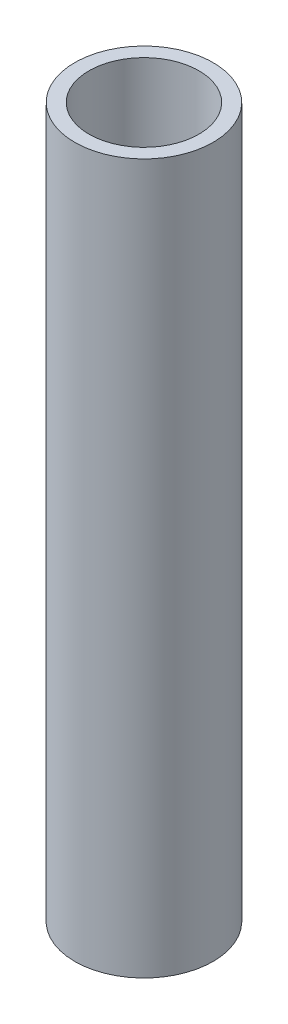
ISO-10303-21;
HEADER;
FILE_DESCRIPTION(('STEP AP214'),'2;1');
FILE_NAME('part.step','',(''),(''),'','','');
FILE_SCHEMA(('AUTOMOTIVE_DESIGN { 1 0 10303 214 1 1 1 1 }'));
ENDSEC;
DATA;
#1=APPLICATION_CONTEXT('core data for automotive mechanical design processes');
#2=APPLICATION_PROTOCOL_DEFINITION('international standard','automotive_design',2000,#1);
#3=PRODUCT_CONTEXT('',#1,'mechanical');
#4=PRODUCT('Part','Part','',(#3));
#5=PRODUCT_RELATED_PRODUCT_CATEGORY('part','',(#4));
#6=PRODUCT_DEFINITION_FORMATION('','',#4);
#7=PRODUCT_DEFINITION_CONTEXT('part definition',#1,'design');
#8=PRODUCT_DEFINITION('design','',#6,#7);
#9=PRODUCT_DEFINITION_SHAPE('','',#8);
#10=(LENGTH_UNIT() NAMED_UNIT(*) SI_UNIT(.MILLI.,.METRE.));
#11=(NAMED_UNIT(*) PLANE_ANGLE_UNIT() SI_UNIT($,.RADIAN.));
#12=(NAMED_UNIT(*) SI_UNIT($,.STERADIAN.) SOLID_ANGLE_UNIT());
#13=UNCERTAINTY_MEASURE_WITH_UNIT(LENGTH_MEASURE(1.E-05),#10,'distance_accuracy_value','');
#14=(GEOMETRIC_REPRESENTATION_CONTEXT(3) GLOBAL_UNCERTAINTY_ASSIGNED_CONTEXT((#13)) GLOBAL_UNIT_ASSIGNED_CONTEXT((#10,
#11,#12)) REPRESENTATION_CONTEXT('',''));
#15=CARTESIAN_POINT('',(0.,0.,0.));
#16=DIRECTION('',(0.,0.,1.));
#17=DIRECTION('',(1.,0.,0.));
#18=AXIS2_PLACEMENT_3D('',#15,#16,#17);
#19=CARTESIAN_POINT('',(0.,20.,0.));
#20=DIRECTION('',(0.,1.,0.));
#21=DIRECTION('',(0.,0.,1.));
#22=AXIS2_PLACEMENT_3D('',#19,#20,#21);
#23=PLANE('',#22);
#24=CARTESIAN_POINT('',(0.,20.,0.));
#25=DIRECTION('',(0.,1.,0.));
#26=DIRECTION('',(0.,0.,1.));
#27=AXIS2_PLACEMENT_3D('',#24,#25,#26);
#28=CIRCLE('',#27,1.95);
#29=CARTESIAN_POINT('',(0.,20.,1.95));
#30=VERTEX_POINT('',#29);
#31=EDGE_CURVE('E10',#30,#30,#28,.T.);
#32=ORIENTED_EDGE('',*,*,#31,.T.);
#33=EDGE_LOOP('',(#32));
#34=FACE_BOUND('',#33,.T.);
#35=CARTESIAN_POINT('',(0.,20.,0.));
#36=DIRECTION('',(0.,1.,0.));
#37=DIRECTION('',(0.,0.,1.));
#38=AXIS2_PLACEMENT_3D('',#35,#36,#37);
#39=CIRCLE('',#38,1.55);
#40=CARTESIAN_POINT('',(0.,20.,1.55));
#41=VERTEX_POINT('',#40);
#42=EDGE_CURVE('E42',#41,#41,#39,.T.);
#43=ORIENTED_EDGE('',*,*,#42,.F.);
#44=EDGE_LOOP('',(#43));
#45=FACE_BOUND('',#44,.T.);
#46=ADVANCED_FACE('F31',(#34,#45),#23,.T.);
#47=CARTESIAN_POINT('',(0.,0.,0.));
#48=DIRECTION('',(0.,1.,0.));
#49=DIRECTION('',(0.,0.,1.));
#50=AXIS2_PLACEMENT_3D('',#47,#48,#49);
#51=PLANE('',#50);
#52=CARTESIAN_POINT('',(0.,0.,0.));
#53=DIRECTION('',(0.,1.,0.));
#54=DIRECTION('',(0.,0.,1.));
#55=AXIS2_PLACEMENT_3D('',#52,#53,#54);
#56=CIRCLE('',#55,1.95);
#57=CARTESIAN_POINT('',(0.,0.,1.95));
#58=VERTEX_POINT('',#57);
#59=EDGE_CURVE('E35',#58,#58,#56,.T.);
#60=ORIENTED_EDGE('',*,*,#59,.F.);
#61=EDGE_LOOP('',(#60));
#62=FACE_BOUND('',#61,.T.);
#63=CARTESIAN_POINT('',(0.,0.,0.));
#64=DIRECTION('',(0.,1.,0.));
#65=DIRECTION('',(0.,0.,1.));
#66=AXIS2_PLACEMENT_3D('',#63,#64,#65);
#67=CIRCLE('',#66,1.55);
#68=CARTESIAN_POINT('',(0.,0.,1.55));
#69=VERTEX_POINT('',#68);
#70=EDGE_CURVE('E44',#69,#69,#67,.T.);
#71=ORIENTED_EDGE('',*,*,#70,.T.);
#72=EDGE_LOOP('',(#71));
#73=FACE_BOUND('',#72,.T.);
#74=ADVANCED_FACE('F54',(#62,#73),#51,.F.);
#75=CARTESIAN_POINT('',(0.,20.,0.));
#76=DIRECTION('',(0.,-1.,0.));
#77=DIRECTION('',(0.,0.,-1.));
#78=AXIS2_PLACEMENT_3D('',#75,#76,#77);
#79=CYLINDRICAL_SURFACE('',#78,1.95);
#80=ORIENTED_EDGE('',*,*,#31,.F.);
#81=EDGE_LOOP('',(#80));
#82=FACE_BOUND('',#81,.T.);
#83=ORIENTED_EDGE('',*,*,#59,.T.);
#84=EDGE_LOOP('',(#83));
#85=FACE_BOUND('',#84,.T.);
#86=ADVANCED_FACE('F33',(#82,#85),#79,.T.);
#87=CARTESIAN_POINT('',(0.,20.,0.));
#88=DIRECTION('',(0.,-1.,0.));
#89=DIRECTION('',(0.,0.,-1.));
#90=AXIS2_PLACEMENT_3D('',#87,#88,#89);
#91=CYLINDRICAL_SURFACE('',#90,1.55);
#92=ORIENTED_EDGE('',*,*,#42,.T.);
#93=EDGE_LOOP('',(#92));
#94=FACE_BOUND('',#93,.T.);
#95=ORIENTED_EDGE('',*,*,#70,.F.);
#96=EDGE_LOOP('',(#95));
#97=FACE_BOUND('',#96,.T.);
#98=ADVANCED_FACE('F50',(#94,#97),#91,.F.);
#99=CLOSED_SHELL('',(#46,#74,#86,#98));
#100=MANIFOLD_SOLID_BREP('B2',#99);
#101=ADVANCED_BREP_SHAPE_REPRESENTATION('',(#18,#100),#14);
#102=SHAPE_DEFINITION_REPRESENTATION(#9,#101);
ENDSEC;
END-ISO-10303-21;
